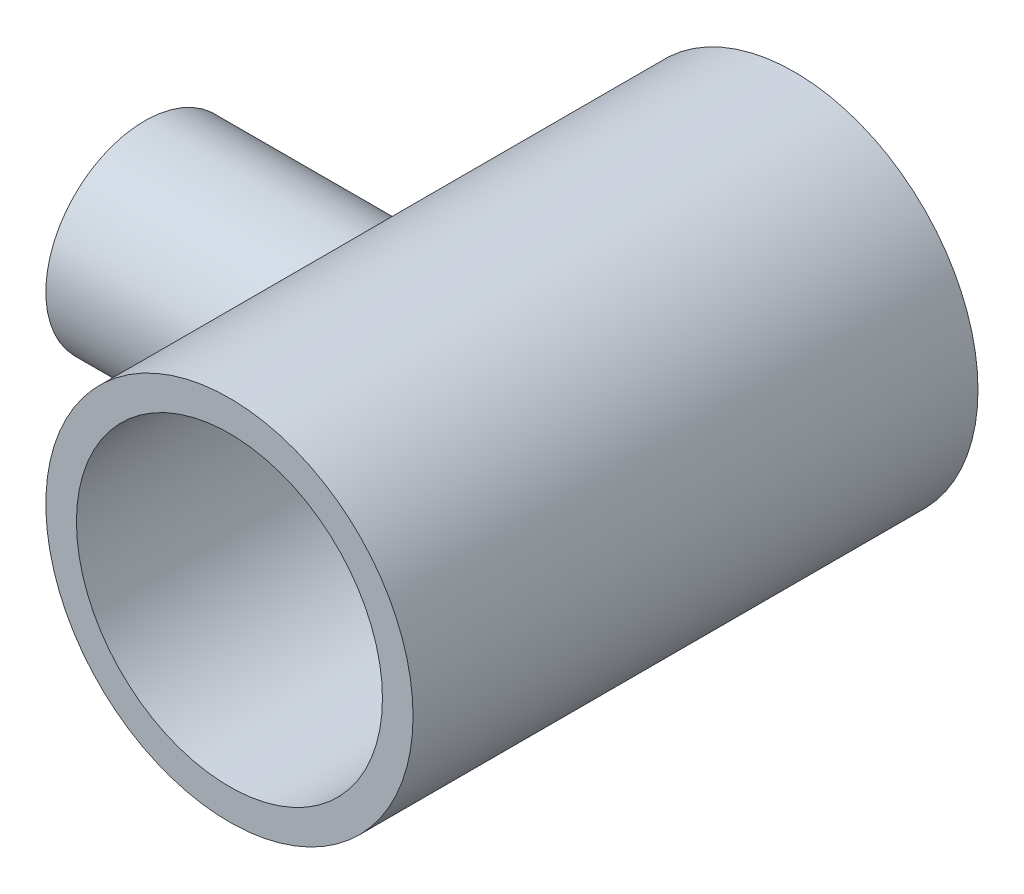
ISO-10303-21;
HEADER;
FILE_DESCRIPTION(('STEP AP214'),'2;1');
FILE_NAME('part.step','',(''),(''),'','','');
FILE_SCHEMA(('AUTOMOTIVE_DESIGN { 1 0 10303 214 1 1 1 1 }'));
ENDSEC;
DATA;
#1=APPLICATION_CONTEXT('core data for automotive mechanical design processes');
#2=APPLICATION_PROTOCOL_DEFINITION('international standard','automotive_design',2000,#1);
#3=PRODUCT_CONTEXT('',#1,'mechanical');
#4=PRODUCT('Part','Part','',(#3));
#5=PRODUCT_RELATED_PRODUCT_CATEGORY('part','',(#4));
#6=PRODUCT_DEFINITION_FORMATION('','',#4);
#7=PRODUCT_DEFINITION_CONTEXT('part definition',#1,'design');
#8=PRODUCT_DEFINITION('design','',#6,#7);
#9=PRODUCT_DEFINITION_SHAPE('','',#8);
#10=(LENGTH_UNIT() NAMED_UNIT(*) SI_UNIT(.MILLI.,.METRE.));
#11=(NAMED_UNIT(*) PLANE_ANGLE_UNIT() SI_UNIT($,.RADIAN.));
#12=(NAMED_UNIT(*) SI_UNIT($,.STERADIAN.) SOLID_ANGLE_UNIT());
#13=UNCERTAINTY_MEASURE_WITH_UNIT(LENGTH_MEASURE(1.E-05),#10,'distance_accuracy_value','');
#14=(GEOMETRIC_REPRESENTATION_CONTEXT(3) GLOBAL_UNCERTAINTY_ASSIGNED_CONTEXT((#13)) GLOBAL_UNIT_ASSIGNED_CONTEXT((#10,
#11,#12)) REPRESENTATION_CONTEXT('',''));
#15=CARTESIAN_POINT('',(0.,0.,0.));
#16=DIRECTION('',(0.,0.,1.));
#17=DIRECTION('',(1.,0.,0.));
#18=AXIS2_PLACEMENT_3D('',#15,#16,#17);
#19=CARTESIAN_POINT('',(0.,0.,76.2));
#20=DIRECTION('',(0.,0.,-1.));
#21=DIRECTION('',(-1.,0.,0.));
#22=AXIS2_PLACEMENT_3D('',#19,#20,#21);
#23=CYLINDRICAL_SURFACE('',#22,24.765);
#24=CARTESIAN_POINT('',(0.,0.,76.2));
#25=DIRECTION('',(0.,0.,1.));
#26=DIRECTION('',(1.,0.,0.));
#27=AXIS2_PLACEMENT_3D('',#24,#25,#26);
#28=CIRCLE('',#27,24.765);
#29=CARTESIAN_POINT('',(24.765,0.,76.2));
#30=VERTEX_POINT('',#29);
#31=EDGE_CURVE('E54',#30,#30,#28,.T.);
#32=ORIENTED_EDGE('',*,*,#31,.F.);
#33=EDGE_LOOP('',(#32));
#34=FACE_BOUND('',#33,.T.);
#35=CARTESIAN_POINT('',(0.,0.,0.));
#36=DIRECTION('',(0.,0.,1.));
#37=DIRECTION('',(1.,0.,0.));
#38=AXIS2_PLACEMENT_3D('',#35,#36,#37);
#39=CIRCLE('',#38,24.765);
#40=CARTESIAN_POINT('',(24.765,0.,0.));
#41=VERTEX_POINT('',#40);
#42=EDGE_CURVE('E58',#41,#41,#39,.T.);
#43=ORIENTED_EDGE('',*,*,#42,.T.);
#44=EDGE_LOOP('',(#43));
#45=FACE_BOUND('',#44,.T.);
#46=CARTESIAN_POINT('',(-24.13,5.572102385994,50.2150278579952));
#47=CARTESIAN_POINT('',(-24.1999454776791,5.26920604530642,50.3543405201109));
#48=CARTESIAN_POINT('',(-24.2652826669389,4.9602122231935,50.4826886896111));
#49=CARTESIAN_POINT('',(-24.3853365538129,4.33162018180949,50.7163263022125));
#50=CARTESIAN_POINT('',(-24.4400540571302,4.01202276917638,50.8216174946973));
#51=CARTESIAN_POINT('',(-24.5376153398113,3.364209364884,51.0080547532257));
#52=CARTESIAN_POINT('',(-24.5804636167072,3.03599668950541,51.0892099658267));
#53=CARTESIAN_POINT('',(-24.6533056077544,2.37296512886387,51.2265330266175));
#54=CARTESIAN_POINT('',(-24.6832992533878,2.0381462083982,51.2827007416188));
#55=CARTESIAN_POINT('',(-24.7297629307559,1.36335145758565,51.3694960374983));
#56=CARTESIAN_POINT('',(-24.7461962300501,1.02336414440483,51.4000542504963));
#57=CARTESIAN_POINT('',(-24.7649908288114,0.341647218994466,51.4349911592197));
#58=CARTESIAN_POINT('',(-24.7673518327205,-8.24296781728063E-05,51.4393693050897));
#59=CARTESIAN_POINT('',(-24.7579435817629,-0.682569836252295,51.4218925909566));
#60=CARTESIAN_POINT('',(-24.7461784193983,-1.02332784698473,51.4000453287366));
#61=CARTESIAN_POINT('',(-24.7088194568266,-1.70138958196502,51.3304053824082));
#62=CARTESIAN_POINT('',(-24.683227028674,-2.03869364555861,51.2826152725597));
#63=CARTESIAN_POINT('',(-24.6242904366038,-2.65095542160331,51.1718960164275));
#64=CARTESIAN_POINT('',(-24.5929831883133,-2.92682873938228,51.1128825298856));
#65=CARTESIAN_POINT('',(-24.5217711962341,-3.47331202029603,50.9777933642753));
#66=CARTESIAN_POINT('',(-24.4818643294543,-3.74392066572106,50.9017134718264));
#67=CARTESIAN_POINT('',(-24.3941023808307,-4.27859628082947,50.7330682619251));
#68=CARTESIAN_POINT('',(-24.3462480525216,-4.54266386797491,50.6405045073218));
#69=CARTESIAN_POINT('',(-24.2433303234745,-5.06325999453634,50.4395100978715));
#70=CARTESIAN_POINT('',(-24.1882659797414,-5.31978754241029,50.3310773673086));
#71=CARTESIAN_POINT('',(-24.0488654299459,-5.92344731219771,50.0534305230681));
#72=CARTESIAN_POINT('',(-23.9615228310355,-6.26662373026075,49.8770641194046));
#73=CARTESIAN_POINT('',(-23.7768462365116,-6.93447542180444,49.4966252981884));
#74=CARTESIAN_POINT('',(-23.6795095062093,-7.25914559343428,49.2925452924235));
#75=CARTESIAN_POINT('',(-23.4773170450136,-7.88861363991228,48.8581788515691));
#76=CARTESIAN_POINT('',(-23.3724516751632,-8.19338505008632,48.6278585914012));
#77=CARTESIAN_POINT('',(-23.1580536333741,-8.78109508131523,48.1428955091955));
#78=CARTESIAN_POINT('',(-23.0485212425593,-9.06403501453933,47.888254151026));
#79=CARTESIAN_POINT('',(-22.8279341663124,-9.6060410360312,47.3568806958763));
#80=CARTESIAN_POINT('',(-22.7168844897664,-9.86517057709684,47.0802112104309));
#81=CARTESIAN_POINT('',(-22.4958789155956,-10.3592435124227,46.5054718291505));
#82=CARTESIAN_POINT('',(-22.3859233971323,-10.5941787693425,46.2073947900885));
#83=CARTESIAN_POINT('',(-22.1702426324339,-11.0384116614058,45.5913209025615));
#84=CARTESIAN_POINT('',(-22.0645167945489,-11.2477128907527,45.2733268561756));
#85=CARTESIAN_POINT('',(-21.8604889955979,-11.6392870514014,44.6187925432244));
#86=CARTESIAN_POINT('',(-21.7621874587663,-11.8215584387541,44.2822512187404));
#87=CARTESIAN_POINT('',(-21.5747302621303,-12.1603612959076,43.5863591699654));
#88=CARTESIAN_POINT('',(-21.4857605292189,-12.3163973009445,43.2267161027455));
#89=CARTESIAN_POINT('',(-21.3224647795251,-12.5969875743155,42.4923255582924));
#90=CARTESIAN_POINT('',(-21.2481306964125,-12.721559194782,42.1175865390511));
#91=CARTESIAN_POINT('',(-21.1173997840682,-12.9374105240581,41.3560764501654));
#92=CARTESIAN_POINT('',(-21.0609801221587,-13.0287326327214,40.9693213916981));
#93=CARTESIAN_POINT('',(-20.9687179429209,-13.1767129971846,40.1868383493581));
#94=CARTESIAN_POINT('',(-20.9328710741117,-13.2333785835701,39.7911122814214));
#95=CARTESIAN_POINT('',(-20.8870074970466,-13.3056250492711,39.0495675129646));
#96=CARTESIAN_POINT('',(-20.8741178572606,-13.3257821683061,38.7043646114952));
#97=CARTESIAN_POINT('',(-20.8655504677624,-13.3391946390034,38.013237429608));
#98=CARTESIAN_POINT('',(-20.8698710141497,-13.3324526538206,37.6673132239921));
#99=CARTESIAN_POINT('',(-20.8955460415799,-13.292175759747,36.9776749304033));
#100=CARTESIAN_POINT('',(-20.9169007645719,-13.2586404702909,36.6339608738925));
#101=CARTESIAN_POINT('',(-20.9757787652057,-13.1652937912847,35.9515408012778));
#102=CARTESIAN_POINT('',(-21.01330203659,-13.1054824119037,35.6128347832357));
#103=CARTESIAN_POINT('',(-21.0996084968029,-12.9660291418481,34.9688128089415));
#104=CARTESIAN_POINT('',(-21.1472984603982,-12.8882751900737,34.6629381361306));
#105=CARTESIAN_POINT('',(-21.2537698529738,-12.711926095849,34.0591882240181));
#106=CARTESIAN_POINT('',(-21.3125549341691,-12.6133240894898,33.7613156557815));
#107=CARTESIAN_POINT('',(-21.5031030034778,-12.2876069601238,32.8820210149231));
#108=CARTESIAN_POINT('',(-21.6491120647773,-12.0304987147707,32.3145490517728));
#109=CARTESIAN_POINT('',(-21.9832025099797,-11.4097092841818,31.1633964896299));
#110=CARTESIAN_POINT('',(-22.1741905947711,-11.0371760757069,30.5853480262801));
#111=CARTESIAN_POINT('',(-22.4686112899243,-10.4172618654074,29.7681285572339));
#112=CARTESIAN_POINT('',(-22.5681420289838,-10.2002767947908,29.503875115831));
#113=CARTESIAN_POINT('',(-22.7677089779416,-9.74669073070748,28.9928091912943));
#114=CARTESIAN_POINT('',(-22.8677452501671,-9.51008726019108,28.7459989178718));
#115=CARTESIAN_POINT('',(-23.0747848103519,-8.99681327442867,28.2502403823048));
#116=CARTESIAN_POINT('',(-23.1816351645315,-8.71844798480434,28.0029816038162));
#117=CARTESIAN_POINT('',(-23.3906570062038,-8.14104494905144,27.5319174275667));
#118=CARTESIAN_POINT('',(-23.4928300872819,-7.84201433223622,27.3081040077888));
#119=CARTESIAN_POINT('',(-23.6899647997567,-7.2246630275067,26.8854393624758));
#120=CARTESIAN_POINT('',(-23.7849283519727,-6.90634751855014,26.6865814788051));
#121=CARTESIAN_POINT('',(-23.9652403196317,-6.25200693205665,26.3154313635807));
#122=CARTESIAN_POINT('',(-24.050590048919,-5.91598428364818,26.1431355008187));
#123=CARTESIAN_POINT('',(-24.1999454776791,-5.26920604530642,25.8456594798891));
#124=CARTESIAN_POINT('',(-24.2652826669389,-4.9602122231935,25.7173113103889));
#125=CARTESIAN_POINT('',(-24.3853365538129,-4.33162018180948,25.4836736977875));
#126=CARTESIAN_POINT('',(-24.4400540571302,-4.01202276917637,25.3783825053027));
#127=CARTESIAN_POINT('',(-24.5376153398113,-3.364209364884,25.1919452467743));
#128=CARTESIAN_POINT('',(-24.5804636167072,-3.03599668950541,25.1107900341733));
#129=CARTESIAN_POINT('',(-24.6533056077544,-2.37296512886387,24.9734669733825));
#130=CARTESIAN_POINT('',(-24.6832992533878,-2.0381462083982,24.9172992583812));
#131=CARTESIAN_POINT('',(-24.7297629307559,-1.36335145758565,24.8305039625017));
#132=CARTESIAN_POINT('',(-24.7461962300501,-1.02336414440483,24.7999457495036));
#133=CARTESIAN_POINT('',(-24.7649908288114,-0.341647218994465,24.7650088407803));
#134=CARTESIAN_POINT('',(-24.7673518327205,8.24296781719931E-05,24.7606306949103));
#135=CARTESIAN_POINT('',(-24.7579435817629,0.682569836252294,24.7781074090434));
#136=CARTESIAN_POINT('',(-24.7461784193983,1.02332784698473,24.7999546712634));
#137=CARTESIAN_POINT('',(-24.7088194568266,1.70138958196502,24.8695946175918));
#138=CARTESIAN_POINT('',(-24.683227028674,2.03869364555861,24.9173847274402));
#139=CARTESIAN_POINT('',(-24.6242904366038,2.65095542160331,25.0281039835725));
#140=CARTESIAN_POINT('',(-24.5929831883133,2.92682873938228,25.0871174701144));
#141=CARTESIAN_POINT('',(-24.5217711962341,3.47331202029603,25.2222066357247));
#142=CARTESIAN_POINT('',(-24.4818643294543,3.74392066572106,25.2982865281736));
#143=CARTESIAN_POINT('',(-24.3941023808307,4.27859628082947,25.4669317380749));
#144=CARTESIAN_POINT('',(-24.3462480525216,4.54266386797491,25.5594954926782));
#145=CARTESIAN_POINT('',(-24.2433303234745,5.06325999453633,25.7604899021285));
#146=CARTESIAN_POINT('',(-24.1882659797414,5.31978754241029,25.8689226326914));
#147=CARTESIAN_POINT('',(-24.0488654299459,5.92344731219771,26.1465694769319));
#148=CARTESIAN_POINT('',(-23.9615228310355,6.26662373026075,26.3229358805954));
#149=CARTESIAN_POINT('',(-23.7768462365116,6.93447542180445,26.7033747018116));
#150=CARTESIAN_POINT('',(-23.6795095062093,7.25914559343429,26.9074547075765));
#151=CARTESIAN_POINT('',(-23.4773170450136,7.88861363991229,27.3418211484309));
#152=CARTESIAN_POINT('',(-23.3724516751632,8.19338505008633,27.5721414085988));
#153=CARTESIAN_POINT('',(-23.158053633374,8.78109508131524,28.0571044908045));
#154=CARTESIAN_POINT('',(-23.0485212425593,9.06403501453934,28.3117458489739));
#155=CARTESIAN_POINT('',(-22.8279341663124,9.60604103603121,28.8431193041237));
#156=CARTESIAN_POINT('',(-22.7168844897664,9.86517057709685,29.1197887895691));
#157=CARTESIAN_POINT('',(-22.4958789155956,10.3592435124227,29.6945281708495));
#158=CARTESIAN_POINT('',(-22.3859233971323,10.5941787693425,29.9926052099115));
#159=CARTESIAN_POINT('',(-22.1702426324338,11.0384116614058,30.6086790974385));
#160=CARTESIAN_POINT('',(-22.0645167945489,11.2477128907527,30.9266731438244));
#161=CARTESIAN_POINT('',(-21.8604889955979,11.6392870514014,31.5812074567756));
#162=CARTESIAN_POINT('',(-21.7621874587663,11.8215584387541,31.9177487812596));
#163=CARTESIAN_POINT('',(-21.5747302621303,12.1603612959076,32.6136408300345));
#164=CARTESIAN_POINT('',(-21.4857605292189,12.3163973009445,32.9732838972545));
#165=CARTESIAN_POINT('',(-21.3224647795251,12.5969875743155,33.7076744417076));
#166=CARTESIAN_POINT('',(-21.2481306964125,12.721559194782,34.0824134609489));
#167=CARTESIAN_POINT('',(-21.1173997840682,12.9374105240581,34.8439235498345));
#168=CARTESIAN_POINT('',(-21.0609801221587,13.0287326327214,35.2306786083019));
#169=CARTESIAN_POINT('',(-20.9687179429209,13.1767129971846,36.0131616506419));
#170=CARTESIAN_POINT('',(-20.9328710741117,13.2333785835702,36.4088877185786));
#171=CARTESIAN_POINT('',(-20.8870074970466,13.3056250492711,37.1504324870354));
#172=CARTESIAN_POINT('',(-20.8741178572606,13.3257821683061,37.4956353885047));
#173=CARTESIAN_POINT('',(-20.8655504677624,13.3391946390034,38.186762570392));
#174=CARTESIAN_POINT('',(-20.8698710141497,13.3324526538206,38.5326867760078));
#175=CARTESIAN_POINT('',(-20.8955460415799,13.292175759747,39.2223250695967));
#176=CARTESIAN_POINT('',(-20.9169007645719,13.2586404702909,39.5660391261074));
#177=CARTESIAN_POINT('',(-20.9757787652057,13.1652937912847,40.2484591987221));
#178=CARTESIAN_POINT('',(-21.01330203659,13.1054824119037,40.5871652167643));
#179=CARTESIAN_POINT('',(-21.0996084968029,12.9660291418481,41.2311871910585));
#180=CARTESIAN_POINT('',(-21.1472984603982,12.8882751900737,41.5370618638694));
#181=CARTESIAN_POINT('',(-21.2537698529738,12.711926095849,42.1408117759818));
#182=CARTESIAN_POINT('',(-21.3125549341691,12.6133240894898,42.4386843442184));
#183=CARTESIAN_POINT('',(-21.5031030034778,12.2876069601238,43.3179789850769));
#184=CARTESIAN_POINT('',(-21.6491120647773,12.0304987147708,43.8854509482271));
#185=CARTESIAN_POINT('',(-21.9832025099797,11.4097092841818,45.03660351037));
#186=CARTESIAN_POINT('',(-22.1741905947711,11.0371760757069,45.6146519737199));
#187=CARTESIAN_POINT('',(-22.4686112899243,10.4172618654074,46.4318714427661));
#188=CARTESIAN_POINT('',(-22.5681420289838,10.2002767947908,46.696124884169));
#189=CARTESIAN_POINT('',(-22.7677089779416,9.74669073070749,47.2071908087057));
#190=CARTESIAN_POINT('',(-22.8677452501671,9.51008726019109,47.4540010821282));
#191=CARTESIAN_POINT('',(-23.0747848103519,8.99681327442868,47.9497596176952));
#192=CARTESIAN_POINT('',(-23.1816351645315,8.71844798480435,48.1970183961838));
#193=CARTESIAN_POINT('',(-23.3906570062038,8.14104494905144,48.6680825724333));
#194=CARTESIAN_POINT('',(-23.4928300872819,7.84201433223623,48.8918959922112));
#195=CARTESIAN_POINT('',(-23.6899647997567,7.22466302750671,49.3145606375242));
#196=CARTESIAN_POINT('',(-23.7849283519727,6.90634751855015,49.5134185211948));
#197=CARTESIAN_POINT('',(-23.9652403196317,6.25200693205666,49.8845686364193));
#198=CARTESIAN_POINT('',(-24.050590048919,5.91598428364818,50.0568644991813));
#199=CARTESIAN_POINT('',(-24.13,5.572102385994,50.2150278579952));
#200=B_SPLINE_CURVE_WITH_KNOTS('',3,(#46,#47,#48,#49,#50,#51,#52,#53,#54,#55,#56,#57,#58,#59,
#60,#61,#62,#63,#64,#65,#66,#67,#68,#69,#70,#71,#72,#73,#74,#75,#76,#77,#78,#79,#80,#81,#82,#83,
#84,#85,#86,#87,#88,#89,#90,#91,#92,#93,#94,#95,#96,#97,#98,#99,#100,#101,#102,#103,#104,#105,
#106,#107,#108,#109,#110,#111,#112,#113,#114,#115,#116,#117,#118,#119,#120,#121,#122,#123,#124,
#125,#126,#127,#128,#129,#130,#131,#132,#133,#134,#135,#136,#137,#138,#139,#140,#141,#142,#143,
#144,#145,#146,#147,#148,#149,#150,#151,#152,#153,#154,#155,#156,#157,#158,#159,#160,#161,#162,
#163,#164,#165,#166,#167,#168,#169,#170,#171,#172,#173,#174,#175,#176,#177,#178,#179,#180,#181,
#182,#183,#184,#185,#186,#187,#188,#189,#190,#191,#192,#193,#194,#195,#196,#197,#198,#199),
.UNSPECIFIED.,.T.,.F.,(4,2,2,2,2,2,2,2,2,2,2,2,2,2,2,2,2,2,2,2,2,2,2,2,2,2,2,2,2,2,2,2,2,2,2,2,
2,2,2,2,2,2,2,2,2,2,2,2,2,2,2,2,2,2,2,2,2,2,2,2,2,2,2,2,2,2,2,2,2,2,2,2,2,2,2,2,4),(0.,
1.0216739578275,2.04327037211932,3.06447914805145,4.08569336717103,5.10966486687263,
6.1336578727906,7.15735428849395,8.18094914329554,9.03181075268718,9.882882655747,
10.7338739108673,11.5849765781845,12.7701252582745,13.9555990985924,15.1426187467197,
16.3295669940014,17.5132543533992,18.6973385347762,19.8812565025727,21.0652420699295,
22.269548349654,23.4731890153794,24.6752893749619,25.8771353769377,26.9138017118356,
27.950365413783,28.9869438390827,30.0235218632144,30.9800561936957,31.9369059404943,
33.8494610587343,35.9818145998972,37.049382818311,38.1170860354088,39.2778723619654,
40.4382602099196,41.5983378052907,42.7582566692956,43.7799306271231,44.8015270414149,
45.8227358173471,46.8439500364667,47.8679215361683,48.8919145420862,49.9156109577896,
50.9392058125912,51.7900674219828,52.6411393250426,53.4921305801629,54.3432332474801,
55.5283819275702,56.7138557678881,57.9008754160153,59.087823663297,60.2715110226948,
61.4555952040718,62.6395131718684,63.8234987392251,65.0278050189496,66.231445684675,
67.4335460442575,68.6353920462333,69.6720583811313,70.7086220830787,71.7452005083783,
72.7817785325101,73.7383128629913,74.6951626097899,76.60771772803,78.7400712691929,
79.8076394876066,80.8753427047044,82.0361290312611,83.1965168792152,84.3565944745863,
85.5165133385913),.UNSPECIFIED.);
#201=CARTESIAN_POINT('',(-24.13,5.572102385994,50.2150278579952));
#202=VERTEX_POINT('',#201);
#203=EDGE_CURVE('E10',#202,#202,#200,.T.);
#204=ORIENTED_EDGE('',*,*,#203,.T.);
#205=EDGE_LOOP('',(#204));
#206=FACE_BOUND('',#205,.T.);
#207=ADVANCED_FACE('F43',(#34,#45,#206),#23,.T.);
#208=CARTESIAN_POINT('',(0.,0.,76.2));
#209=DIRECTION('',(0.,0.,1.));
#210=DIRECTION('',(1.,0.,0.));
#211=AXIS2_PLACEMENT_3D('',#208,#209,#210);
#212=PLANE('',#211);
#213=ORIENTED_EDGE('',*,*,#31,.T.);
#214=EDGE_LOOP('',(#213));
#215=FACE_BOUND('',#214,.T.);
#216=CARTESIAN_POINT('',(0.,0.,76.2));
#217=DIRECTION('',(0.,0.,1.));
#218=DIRECTION('',(1.,0.,0.));
#219=AXIS2_PLACEMENT_3D('',#216,#217,#218);
#220=CIRCLE('',#219,20.6375);
#221=CARTESIAN_POINT('',(20.6375,0.,76.2));
#222=VERTEX_POINT('',#221);
#223=EDGE_CURVE('E66',#222,#222,#220,.T.);
#224=ORIENTED_EDGE('',*,*,#223,.F.);
#225=EDGE_LOOP('',(#224));
#226=FACE_BOUND('',#225,.T.);
#227=ADVANCED_FACE('F101',(#215,#226),#212,.T.);
#228=CARTESIAN_POINT('',(0.,0.,0.));
#229=DIRECTION('',(0.,0.,1.));
#230=DIRECTION('',(1.,0.,0.));
#231=AXIS2_PLACEMENT_3D('',#228,#229,#230);
#232=PLANE('',#231);
#233=ORIENTED_EDGE('',*,*,#42,.F.);
#234=EDGE_LOOP('',(#233));
#235=FACE_BOUND('',#234,.T.);
#236=CARTESIAN_POINT('',(0.,0.,0.));
#237=DIRECTION('',(0.,0.,1.));
#238=DIRECTION('',(1.,0.,0.));
#239=AXIS2_PLACEMENT_3D('',#236,#237,#238);
#240=CIRCLE('',#239,20.6375);
#241=CARTESIAN_POINT('',(20.6375,0.,0.));
#242=VERTEX_POINT('',#241);
#243=EDGE_CURVE('E67',#242,#242,#240,.T.);
#244=ORIENTED_EDGE('',*,*,#243,.T.);
#245=EDGE_LOOP('',(#244));
#246=FACE_BOUND('',#245,.T.);
#247=ADVANCED_FACE('F106',(#235,#246),#232,.F.);
#248=CARTESIAN_POINT('',(0.,0.,76.2));
#249=DIRECTION('',(0.,0.,-1.));
#250=DIRECTION('',(-1.,0.,0.));
#251=AXIS2_PLACEMENT_3D('',#248,#249,#250);
#252=CYLINDRICAL_SURFACE('',#251,20.6375);
#253=CARTESIAN_POINT('',(-20.6375,0.,47.625));
#254=CARTESIAN_POINT('',(-20.6374984666602,-0.252743760017991,47.6249982082883));
#255=CARTESIAN_POINT('',(-20.6328451743191,-0.505538247408141,47.6149275179756));
#256=CARTESIAN_POINT('',(-20.6143475230054,-1.00929495847685,47.5747481085486));
#257=CARTESIAN_POINT('',(-20.6004982810692,-1.26025613707172,47.5446287437538));
#258=CARTESIAN_POINT('',(-20.5639359429426,-1.75884644127563,47.4646115347235));
#259=CARTESIAN_POINT('',(-20.541205894166,-2.00646825149284,47.4146758602259));
#260=CARTESIAN_POINT('',(-20.4874698825623,-2.49612977755325,47.2955675468838));
#261=CARTESIAN_POINT('',(-20.4564633234307,-2.73816908982415,47.2263935219434));
#262=CARTESIAN_POINT('',(-20.3870869517875,-3.21414362937242,47.0698070234145));
#263=CARTESIAN_POINT('',(-20.3487454099372,-3.44810602721868,46.982464466039));
#264=CARTESIAN_POINT('',(-20.2655506525127,-3.90747555093169,46.7901824503452));
#265=CARTESIAN_POINT('',(-20.2206972528637,-4.13288243472707,46.6852424945772));
#266=CARTESIAN_POINT('',(-20.1255430648549,-4.57381138519633,46.458664456048));
#267=CARTESIAN_POINT('',(-20.0752447456194,-4.78933786977083,46.3370339353671));
#268=CARTESIAN_POINT('',(-19.9703237741463,-5.20956541981747,46.0779108086535));
#269=CARTESIAN_POINT('',(-19.9156995325395,-5.41426245998291,45.9404123640901));
#270=CARTESIAN_POINT('',(-19.7411292702069,-6.03184079849686,45.4899216673963));
#271=CARTESIAN_POINT('',(-19.6157350368536,-6.42467216262485,45.1509784191012));
#272=CARTESIAN_POINT('',(-19.363086955276,-7.15019659194299,44.414104391208));
#273=CARTESIAN_POINT('',(-19.2358319668995,-7.48285095916479,44.0161359515396));
#274=CARTESIAN_POINT('',(-19.0495097796509,-7.9405361896864,43.3677885097747));
#275=CARTESIAN_POINT('',(-18.9863854325657,-8.08991051157151,43.1354264849804));
#276=CARTESIAN_POINT('',(-18.8652973594783,-8.36839240314459,42.6576316940986));
#277=CARTESIAN_POINT('',(-18.8073314719855,-8.49750847888612,42.4122044721262));
#278=CARTESIAN_POINT('',(-18.6985316467575,-8.73431837459541,41.9097807094494));
#279=CARTESIAN_POINT('',(-18.6476959320987,-8.84201753471775,41.652787072396));
#280=CARTESIAN_POINT('',(-18.5550162714861,-9.03489018724982,41.1289049825158));
#281=CARTESIAN_POINT('',(-18.5131714845763,-9.12006578654676,40.8620174578426));
#282=CARTESIAN_POINT('',(-18.4421569452185,-9.26278887099573,40.3353211187182));
#283=CARTESIAN_POINT('',(-18.4124161290744,-9.32159941634646,40.0759317392272));
#284=CARTESIAN_POINT('',(-18.3635940134779,-9.41741611281084,39.5521576702283));
#285=CARTESIAN_POINT('',(-18.3445123198835,-9.45442307015738,39.2877731657986));
#286=CARTESIAN_POINT('',(-18.3177869206279,-9.50610011336546,38.756423308372));
#287=CARTESIAN_POINT('',(-18.310135843549,-9.52078459473375,38.4894597304875));
#288=CARTESIAN_POINT('',(-18.3065675957363,-9.52764458648179,37.9551741391716));
#289=CARTESIAN_POINT('',(-18.3106495734705,-9.51982173034194,37.6878521531592));
#290=CARTESIAN_POINT('',(-18.3293981357615,-9.48366581643856,37.181491231397));
#291=CARTESIAN_POINT('',(-18.3429831001792,-9.45742781305665,36.942258824684));
#292=CARTESIAN_POINT('',(-18.3790963086517,-9.38705437440182,36.4670439344543));
#293=CARTESIAN_POINT('',(-18.4016275701437,-9.34291290047802,36.2310625752765));
#294=CARTESIAN_POINT('',(-18.4549089180651,-9.23722012103363,35.7640406480927));
#295=CARTESIAN_POINT('',(-18.4856574124551,-9.17567218777501,35.5329991323765));
#296=CARTESIAN_POINT('',(-18.554457436134,-9.03573953696157,35.0771007786081));
#297=CARTESIAN_POINT('',(-18.5925118533816,-8.95734815989568,34.8522464266007));
#298=CARTESIAN_POINT('',(-18.6757621002307,-8.78247669441646,34.4050492914406));
#299=CARTESIAN_POINT('',(-18.7210992087813,-8.68562966515951,34.1828765307709));
#300=CARTESIAN_POINT('',(-18.8170392774797,-8.47577423969533,33.7473764337816));
#301=CARTESIAN_POINT('',(-18.8676444826763,-8.36275894548885,33.5340529232575));
#302=CARTESIAN_POINT('',(-18.9728097946889,-8.12134385339388,33.1172898456399));
#303=CARTESIAN_POINT('',(-19.0273703896919,-7.99294215518463,32.913851503799));
#304=CARTESIAN_POINT('',(-19.1391297330137,-7.7215063997355,32.5177406930092));
#305=CARTESIAN_POINT('',(-19.1963286625974,-7.57847133629654,32.3250689657897));
#306=CARTESIAN_POINT('',(-19.3182113009881,-7.26255713067662,31.9314382184561));
#307=CARTESIAN_POINT('',(-19.38304478265,-7.08812175925445,31.7317720963854));
#308=CARTESIAN_POINT('',(-19.5125992437686,-6.72326849572815,31.3477096505855));
#309=CARTESIAN_POINT('',(-19.5773202508894,-6.53285535925546,31.1633088155212));
#310=CARTESIAN_POINT('',(-19.705046665756,-6.13684371052784,30.810615635975));
#311=CARTESIAN_POINT('',(-19.7680507875323,-5.93123422189613,30.6423351407448));
#312=CARTESIAN_POINT('',(-19.890654730111,-5.50610382838177,30.3231711579274));
#313=CARTESIAN_POINT('',(-19.9502559040506,-5.28658852724811,30.1722807307543));
#314=CARTESIAN_POINT('',(-20.0665153644042,-4.82695218413292,29.8840245825274));
#315=CARTESIAN_POINT('',(-20.1230013645349,-4.58638166444828,29.7473044381327));
#316=CARTESIAN_POINT('',(-20.2291183105782,-4.09302284996376,29.49479364934));
#317=CARTESIAN_POINT('',(-20.278749011624,-3.84023411917245,29.3790037525114));
#318=CARTESIAN_POINT('',(-20.369677934835,-3.32433229755221,29.1696085366729));
#319=CARTESIAN_POINT('',(-20.4109807113399,-3.06122494428638,29.0759910871715));
#320=CARTESIAN_POINT('',(-20.4840309855558,-2.52658708877404,28.9119564011771));
#321=CARTESIAN_POINT('',(-20.5157793995884,-2.25505739703822,28.8415369397939));
#322=CARTESIAN_POINT('',(-20.566767206272,-1.72619911880894,28.7291172110556));
#323=CARTESIAN_POINT('',(-20.5867586231295,-1.46930724920613,28.6853990542443));
#324=CARTESIAN_POINT('',(-20.6171454339016,-0.95224503408632,28.6191362904349));
#325=CARTESIAN_POINT('',(-20.6275412979828,-0.692074849834747,28.5965906460166));
#326=CARTESIAN_POINT('',(-20.638441659768,-0.170639205007167,28.5729541711615));
#327=CARTESIAN_POINT('',(-20.6389493309102,0.0906258772560157,28.5718564573955));
#328=CARTESIAN_POINT('',(-20.6300665854893,0.612190096177156,28.5911125317588));
#329=CARTESIAN_POINT('',(-20.6206764909421,0.872489263983887,28.6114656220035));
#330=CARTESIAN_POINT('',(-20.5931744841419,1.37348117029621,28.6713889363189));
#331=CARTESIAN_POINT('',(-20.5756575590603,1.61436483671356,28.7096495720811));
#332=CARTESIAN_POINT('',(-20.5326147095047,2.09178897740948,28.8043416538006));
#333=CARTESIAN_POINT('',(-20.5070892093892,2.3283296811102,28.8607721369781));
#334=CARTESIAN_POINT('',(-20.4486393498919,2.79552855244131,28.9912422295146));
#335=CARTESIAN_POINT('',(-20.4157157947838,3.02618735648492,29.0652799247703));
#336=CARTESIAN_POINT('',(-20.3432148549022,3.48036298208437,29.2303266841075));
#337=CARTESIAN_POINT('',(-20.3036349168792,3.70387702375721,29.3213422620182));
#338=CARTESIAN_POINT('',(-20.2174205765729,4.14913087098819,29.5225976807417));
#339=CARTESIAN_POINT('',(-20.1706081530269,4.37060970154715,29.6333382496092));
#340=CARTESIAN_POINT('',(-20.0719244818575,4.80349473121571,29.8712040487219));
#341=CARTESIAN_POINT('',(-20.0200515136931,5.01489746792238,29.9983348562617));
#342=CARTESIAN_POINT('',(-19.9124091107207,5.42656859247075,30.2681066424337));
#343=CARTESIAN_POINT('',(-19.8566389420591,5.62683487046778,30.4107505450532));
#344=CARTESIAN_POINT('',(-19.7424346863705,6.01528661884181,30.7106716961228));
#345=CARTESIAN_POINT('',(-19.6840004680813,6.2034714928448,30.8679496660168));
#346=CARTESIAN_POINT('',(-19.5606331490688,6.58263930295318,31.2104952543784));
#347=CARTESIAN_POINT('',(-19.4955747610747,6.77245914068407,31.3970071063231));
#348=CARTESIAN_POINT('',(-19.3655378138729,7.13579576193095,31.7851994721079));
#349=CARTESIAN_POINT('',(-19.3005592373064,7.30931713563849,31.9868756861731));
#350=CARTESIAN_POINT('',(-19.1723723224939,7.63923336965123,32.4045114482918));
#351=CARTESIAN_POINT('',(-19.1091649895749,7.79561864469283,32.6204788830668));
#352=CARTESIAN_POINT('',(-18.9863383441681,8.09016905227236,33.0655185846936));
#353=CARTESIAN_POINT('',(-18.926719502963,8.22833179444069,33.2945925651776));
#354=CARTESIAN_POINT('',(-18.8111369117361,8.48931867873124,33.7718030442105));
#355=CARTESIAN_POINT('',(-18.7553406719421,8.61154461174978,34.0203082493111));
#356=CARTESIAN_POINT('',(-18.6514411107547,8.83432314160783,34.5282736887463));
#357=CARTESIAN_POINT('',(-18.6033341411058,8.93488602463321,34.7877286535464));
#358=CARTESIAN_POINT('',(-18.5166201533238,9.11323349414907,35.3157246290011));
#359=CARTESIAN_POINT('',(-18.4780070193973,9.19103275081431,35.5842596628927));
#360=CARTESIAN_POINT('',(-18.411817954517,9.32291978257898,36.1284180176997));
#361=CARTESIAN_POINT('',(-18.3842406381219,9.37701053413558,36.4040404442342));
#362=CARTESIAN_POINT('',(-18.3432244686869,9.45697342012278,36.9351604415492));
#363=CARTESIAN_POINT('',(-18.3287456317271,9.48492876127201,37.1902656038046));
#364=CARTESIAN_POINT('',(-18.3104760569068,9.52015106120326,37.7022784913691));
#365=CARTESIAN_POINT('',(-18.3066846557466,9.52741930389921,37.9591861038198));
#366=CARTESIAN_POINT('',(-18.3099353077769,9.52117034069845,38.4726167276745));
#367=CARTESIAN_POINT('',(-18.316974887691,9.50765788011753,38.7291398134974));
#368=CARTESIAN_POINT('',(-18.3416132817479,9.46003935604814,39.2397472821944));
#369=CARTESIAN_POINT('',(-18.3592118659243,9.42593374106177,39.4938317180578));
#370=CARTESIAN_POINT('',(-18.4027251279506,9.34067566203866,39.9798804076689));
#371=CARTESIAN_POINT('',(-18.4279698761402,9.29088677313446,40.21214609634));
#372=CARTESIAN_POINT('',(-18.4862465831517,9.17438463587111,40.6714691528032));
#373=CARTESIAN_POINT('',(-18.5192811748398,9.10766566478201,40.8985247311116));
#374=CARTESIAN_POINT('',(-18.5921701116819,8.95793170842209,41.3460341076254));
#375=CARTESIAN_POINT('',(-18.6320235010232,8.87491900685561,41.5664888260123));
#376=CARTESIAN_POINT('',(-18.7174681311566,8.69326529934365,41.999744962537));
#377=CARTESIAN_POINT('',(-18.7630614761658,8.59461855864673,42.2125435370274));
#378=CARTESIAN_POINT('',(-18.912994813376,8.26236167411003,42.865202626142));
#379=CARTESIAN_POINT('',(-19.02551334394,8.00217914877459,43.2899949679971));
#380=CARTESIAN_POINT('',(-19.2598530370365,7.42041290952758,44.0924088171765));
#381=CARTESIAN_POINT('',(-19.3816784292878,7.0988011768771,44.4700086688098));
#382=CARTESIAN_POINT('',(-19.5687342849062,6.55837464719599,45.0128238928546));
#383=CARTESIAN_POINT('',(-19.6347209276657,6.35857495547643,45.1970475953144));
#384=CARTESIAN_POINT('',(-19.7643117586614,5.94353252341554,45.5480770727863));
#385=CARTESIAN_POINT('',(-19.827916673577,5.72829455279226,45.7148881887131));
#386=CARTESIAN_POINT('',(-19.9510814048259,5.28337820480128,46.0300647908404));
#387=CARTESIAN_POINT('',(-20.010638244416,5.05368943502964,46.178416768337));
#388=CARTESIAN_POINT('',(-20.1240318490562,4.58134463295506,46.4553478189764));
#389=CARTESIAN_POINT('',(-20.1778690261995,4.33868953675281,46.5839283169244));
#390=CARTESIAN_POINT('',(-20.2779804628875,3.84360048959833,46.8193455967042));
#391=CARTESIAN_POINT('',(-20.324302939238,3.59124287741197,46.9263221782798));
#392=CARTESIAN_POINT('',(-20.4084856380814,3.07700724717634,47.1184793134863));
#393=CARTESIAN_POINT('',(-20.4463468225942,2.81513031538129,47.2036623451285));
#394=CARTESIAN_POINT('',(-20.5124023813054,2.28452546490582,47.3510648762239));
#395=CARTESIAN_POINT('',(-20.5406210618079,2.0158166345554,47.4133421460412));
#396=CARTESIAN_POINT('',(-20.5866432302948,1.47327450184142,47.5144111396867));
#397=CARTESIAN_POINT('',(-20.6044536945862,1.19944475920325,47.5532185952191));
#398=CARTESIAN_POINT('',(-20.623673836626,0.770803884636936,47.5950141482999));
#399=CARTESIAN_POINT('',(-20.6288533075435,0.616914938871595,47.6062532123606));
#400=CARTESIAN_POINT('',(-20.6357668885553,0.308690307409145,47.6212467529006));
#401=CARTESIAN_POINT('',(-20.6375009364349,0.154354613695404,47.6250010942267));
#402=CARTESIAN_POINT('',(-20.6375,0.,47.625));
#403=B_SPLINE_CURVE_WITH_KNOTS('',3,(#253,#254,#255,#256,#257,#258,#259,#260,#261,#262,#263,
#264,#265,#266,#267,#268,#269,#270,#271,#272,#273,#274,#275,#276,#277,#278,#279,#280,#281,#282,
#283,#284,#285,#286,#287,#288,#289,#290,#291,#292,#293,#294,#295,#296,#297,#298,#299,#300,#301,
#302,#303,#304,#305,#306,#307,#308,#309,#310,#311,#312,#313,#314,#315,#316,#317,#318,#319,#320,
#321,#322,#323,#324,#325,#326,#327,#328,#329,#330,#331,#332,#333,#334,#335,#336,#337,#338,#339,
#340,#341,#342,#343,#344,#345,#346,#347,#348,#349,#350,#351,#352,#353,#354,#355,#356,#357,#358,
#359,#360,#361,#362,#363,#364,#365,#366,#367,#368,#369,#370,#371,#372,#373,#374,#375,#376,#377,
#378,#379,#380,#381,#382,#383,#384,#385,#386,#387,#388,#389,#390,#391,#392,#393,#394,#395,#396,
#397,#398,#399,#400,#401,#402),.UNSPECIFIED.,.T.,.F.,(4,2,2,2,2,2,2,2,2,2,2,2,2,2,2,2,2,2,2,2,2,
2,2,2,2,2,2,2,2,2,2,2,2,2,2,2,2,2,2,2,2,2,2,2,2,2,2,2,2,2,2,2,2,2,2,2,2,2,2,2,2,2,2,2,2,2,2,2,2,
2,2,2,2,2,4),(0.,0.758077330365939,1.5165575149814,2.27649269369815,3.03648263885875,
3.79360036925444,4.55073950574214,5.30753672701229,6.06461330158579,7.6587346257645,
9.25387746394373,10.1030314167743,10.9518278662571,11.8004124083173,12.6489175444221,
13.4507005056256,14.2524538173796,15.053689868017,15.8548677700452,16.5771696072887,
17.2997152721535,18.0221210495193,18.7448129768648,19.4837471348283,20.2229974957175,
20.9623392531102,21.7017318823029,22.5196473751144,23.3373202807781,24.1555896775847,
24.9735314012729,25.8196708207668,26.6658404560007,27.5115460789655,28.357170567726,
29.1401960031589,29.9231830695627,30.7059188461655,31.4886291578716,32.2213778256061,
32.9540876730007,33.6867179029252,34.4196297981517,35.1748448870852,35.9303176433727,
36.6859330426214,37.4415857126573,38.2625282577847,39.0832389004534,39.9044062980052,
40.7256813065825,41.5720693066211,42.4180545291819,43.2634933438379,44.1088259884219,
44.8789148131541,45.6489558424289,46.418821057379,47.1886695058974,47.9045164648875,
48.6206057185438,49.336594677802,50.0528468807896,51.5782542928277,53.1043591336527,
53.9425136733051,54.7804103679919,55.618916687332,56.4573625524922,57.2901954860983,
58.1229336812366,58.9535569963742,59.7836229298105,60.2465843916653,60.7095542132409),.UNSPECIFIED.);
#404=CARTESIAN_POINT('',(-20.6375,0.,47.625));
#405=VERTEX_POINT('',#404);
#406=EDGE_CURVE('E72',#405,#405,#403,.T.);
#407=ORIENTED_EDGE('',*,*,#406,.F.);
#408=EDGE_LOOP('',(#407));
#409=FACE_BOUND('',#408,.T.);
#410=ORIENTED_EDGE('',*,*,#223,.T.);
#411=EDGE_LOOP('',(#410));
#412=FACE_BOUND('',#411,.T.);
#413=ORIENTED_EDGE('',*,*,#243,.F.);
#414=EDGE_LOOP('',(#413));
#415=FACE_BOUND('',#414,.T.);
#416=ADVANCED_FACE('F79',(#409,#412,#415),#252,.F.);
#417=CARTESIAN_POINT('',(-76.2,0.,38.1));
#418=DIRECTION('',(1.,0.,0.));
#419=DIRECTION('',(0.,0.,-1.));
#420=AXIS2_PLACEMENT_3D('',#417,#418,#419);
#421=CYLINDRICAL_SURFACE('',#420,9.525);
#422=ORIENTED_EDGE('',*,*,#406,.T.);
#423=EDGE_LOOP('',(#422));
#424=FACE_BOUND('',#423,.T.);
#425=CARTESIAN_POINT('',(-49.53,0.,38.1));
#426=DIRECTION('',(1.,0.,0.));
#427=DIRECTION('',(0.,0.,-1.));
#428=AXIS2_PLACEMENT_3D('',#425,#426,#427);
#429=CIRCLE('',#428,9.525);
#430=CARTESIAN_POINT('',(-49.53,0.,28.575));
#431=VERTEX_POINT('',#430);
#432=EDGE_CURVE('E122',#431,#431,#429,.T.);
#433=ORIENTED_EDGE('',*,*,#432,.F.);
#434=EDGE_LOOP('',(#433));
#435=FACE_BOUND('',#434,.T.);
#436=ADVANCED_FACE('F83',(#424,#435),#421,.F.);
#437=CARTESIAN_POINT('',(-49.53,0.,38.1));
#438=DIRECTION('',(1.,0.,0.));
#439=DIRECTION('',(0.,0.,-1.));
#440=AXIS2_PLACEMENT_3D('',#437,#438,#439);
#441=CYLINDRICAL_SURFACE('',#440,13.335);
#442=CARTESIAN_POINT('',(-49.53,0.,38.1));
#443=DIRECTION('',(1.,0.,0.));
#444=DIRECTION('',(0.,0.,-1.));
#445=AXIS2_PLACEMENT_3D('',#442,#443,#444);
#446=CIRCLE('',#445,13.335);
#447=CARTESIAN_POINT('',(-49.53,0.,24.765));
#448=VERTEX_POINT('',#447);
#449=EDGE_CURVE('E78',#448,#448,#446,.T.);
#450=ORIENTED_EDGE('',*,*,#449,.T.);
#451=EDGE_LOOP('',(#450));
#452=FACE_BOUND('',#451,.T.);
#453=ORIENTED_EDGE('',*,*,#203,.F.);
#454=EDGE_LOOP('',(#453));
#455=FACE_BOUND('',#454,.T.);
#456=ADVANCED_FACE('F88',(#452,#455),#441,.T.);
#457=CARTESIAN_POINT('',(-49.53,0.,0.));
#458=DIRECTION('',(1.,0.,0.));
#459=DIRECTION('',(0.,0.,-1.));
#460=AXIS2_PLACEMENT_3D('',#457,#458,#459);
#461=PLANE('',#460);
#462=ORIENTED_EDGE('',*,*,#432,.T.);
#463=EDGE_LOOP('',(#462));
#464=FACE_BOUND('',#463,.T.);
#465=ORIENTED_EDGE('',*,*,#449,.F.);
#466=EDGE_LOOP('',(#465));
#467=FACE_BOUND('',#466,.T.);
#468=ADVANCED_FACE('F93',(#464,#467),#461,.F.);
#469=CLOSED_SHELL('',(#207,#227,#247,#416,#436,#456,#468));
#470=MANIFOLD_SOLID_BREP('B2',#469);
#471=ADVANCED_BREP_SHAPE_REPRESENTATION('',(#18,#470),#14);
#472=SHAPE_DEFINITION_REPRESENTATION(#9,#471);
ENDSEC;
END-ISO-10303-21;
